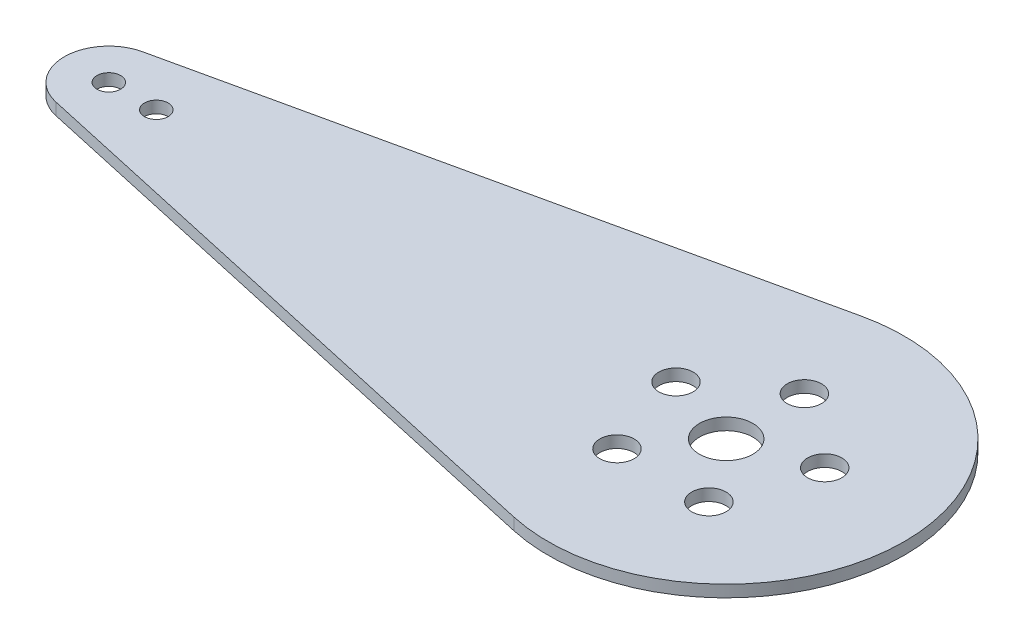
ISO-10303-21;
HEADER;
FILE_DESCRIPTION(('STEP AP214'),'2;1');
FILE_NAME('part.step','',(''),(''),'','','');
FILE_SCHEMA(('AUTOMOTIVE_DESIGN { 1 0 10303 214 1 1 1 1 }'));
ENDSEC;
DATA;
#1=APPLICATION_CONTEXT('core data for automotive mechanical design processes');
#2=APPLICATION_PROTOCOL_DEFINITION('international standard','automotive_design',2000,#1);
#3=PRODUCT_CONTEXT('',#1,'mechanical');
#4=PRODUCT('Part','Part','',(#3));
#5=PRODUCT_RELATED_PRODUCT_CATEGORY('part','',(#4));
#6=PRODUCT_DEFINITION_FORMATION('','',#4);
#7=PRODUCT_DEFINITION_CONTEXT('part definition',#1,'design');
#8=PRODUCT_DEFINITION('design','',#6,#7);
#9=PRODUCT_DEFINITION_SHAPE('','',#8);
#10=(LENGTH_UNIT() NAMED_UNIT(*) SI_UNIT(.MILLI.,.METRE.));
#11=(NAMED_UNIT(*) PLANE_ANGLE_UNIT() SI_UNIT($,.RADIAN.));
#12=(NAMED_UNIT(*) SI_UNIT($,.STERADIAN.) SOLID_ANGLE_UNIT());
#13=UNCERTAINTY_MEASURE_WITH_UNIT(LENGTH_MEASURE(1.E-05),#10,'distance_accuracy_value','');
#14=(GEOMETRIC_REPRESENTATION_CONTEXT(3) GLOBAL_UNCERTAINTY_ASSIGNED_CONTEXT((#13)) GLOBAL_UNIT_ASSIGNED_CONTEXT((#10,
#11,#12)) REPRESENTATION_CONTEXT('',''));
#15=CARTESIAN_POINT('',(0.,0.,0.));
#16=DIRECTION('',(0.,0.,1.));
#17=DIRECTION('',(1.,0.,0.));
#18=AXIS2_PLACEMENT_3D('',#15,#16,#17);
#19=CARTESIAN_POINT('',(-335.347288867355,50.8,-23.2179196647839));
#20=DIRECTION('',(0.,-1.,0.));
#21=DIRECTION('',(0.,0.,-1.));
#22=AXIS2_PLACEMENT_3D('',#19,#20,#21);
#23=PLANE('',#22);
#24=CARTESIAN_POINT('',(24.5816639876925,50.8,33.8337578877547));
#25=DIRECTION('',(0.,-1.,0.));
#26=DIRECTION('',(0.,0.,-1.));
#27=AXIS2_PLACEMENT_3D('',#24,#25,#26);
#28=CIRCLE('',#27,9.17459215458269);
#29=CARTESIAN_POINT('',(24.5816639876925,50.8,24.659165733172));
#30=VERTEX_POINT('',#29);
#31=EDGE_CURVE('E150',#30,#30,#28,.F.);
#32=ORIENTED_EDGE('',*,*,#31,.T.);
#33=EDGE_LOOP('',(#32));
#34=FACE_BOUND('',#33,.T.);
#35=CARTESIAN_POINT('',(1.69559097377339E-12,50.8,-41.8208246835345));
#36=DIRECTION('',(0.,-1.,0.));
#37=DIRECTION('',(0.,0.,-1.));
#38=AXIS2_PLACEMENT_3D('',#35,#36,#37);
#39=CIRCLE('',#38,9.17459215457969);
#40=CARTESIAN_POINT('',(1.69559097377339E-12,50.8,-50.9954168381142));
#41=VERTEX_POINT('',#40);
#42=EDGE_CURVE('E156',#41,#41,#39,.F.);
#43=ORIENTED_EDGE('',*,*,#42,.T.);
#44=EDGE_LOOP('',(#43));
#45=FACE_BOUND('',#44,.T.);
#46=CARTESIAN_POINT('',(-24.5816639876888,50.8,33.8337578877548));
#47=DIRECTION('',(0.,-1.,0.));
#48=DIRECTION('',(0.,0.,-1.));
#49=AXIS2_PLACEMENT_3D('',#46,#47,#48);
#50=CIRCLE('',#49,9.17459215458342);
#51=CARTESIAN_POINT('',(-24.5816639876888,50.8,24.6591657331714));
#52=VERTEX_POINT('',#51);
#53=EDGE_CURVE('E48',#52,#52,#50,.F.);
#54=ORIENTED_EDGE('',*,*,#53,.T.);
#55=EDGE_LOOP('',(#54));
#56=FACE_BOUND('',#55,.T.);
#57=CARTESIAN_POINT('',(-39.773967832111,50.8,-12.9233455459874));
#58=DIRECTION('',(0.,-1.,0.));
#59=DIRECTION('',(0.,0.,-1.));
#60=AXIS2_PLACEMENT_3D('',#57,#58,#59);
#61=CIRCLE('',#60,9.1745921545818);
#62=CARTESIAN_POINT('',(-39.773967832111,50.8,-22.0979377005692));
#63=VERTEX_POINT('',#62);
#64=EDGE_CURVE('E158',#63,#63,#61,.F.);
#65=ORIENTED_EDGE('',*,*,#64,.T.);
#66=EDGE_LOOP('',(#65));
#67=FACE_BOUND('',#66,.T.);
#68=CARTESIAN_POINT('',(39.7739678321145,50.8,-12.9233455459875));
#69=DIRECTION('',(0.,-1.,0.));
#70=DIRECTION('',(0.,0.,-1.));
#71=AXIS2_PLACEMENT_3D('',#68,#69,#70);
#72=CIRCLE('',#71,9.17459215458048);
#73=CARTESIAN_POINT('',(39.7739678321145,50.8,-22.097937700568));
#74=VERTEX_POINT('',#73);
#75=EDGE_CURVE('E153',#74,#74,#72,.F.);
#76=ORIENTED_EDGE('',*,*,#75,.T.);
#77=EDGE_LOOP('',(#76));
#78=FACE_BOUND('',#77,.T.);
#79=CARTESIAN_POINT('',(0.,50.8,0.));
#80=DIRECTION('',(0.,-1.,0.));
#81=DIRECTION('',(0.,0.,-1.));
#82=AXIS2_PLACEMENT_3D('',#79,#80,#81);
#83=CIRCLE('',#82,14.2875);
#84=CARTESIAN_POINT('',(0.,50.8,-14.2875));
#85=VERTEX_POINT('',#84);
#86=EDGE_CURVE('E146',#85,#85,#83,.T.);
#87=ORIENTED_EDGE('',*,*,#86,.F.);
#88=EDGE_LOOP('',(#87));
#89=FACE_BOUND('',#88,.T.);
#90=CARTESIAN_POINT('',(-304.8,50.8,0.));
#91=DIRECTION('',(0.,1.,0.));
#92=DIRECTION('',(0.,0.,1.));
#93=AXIS2_PLACEMENT_3D('',#90,#91,#92);
#94=CIRCLE('',#93,6.35);
#95=CARTESIAN_POINT('',(-304.8,50.8,6.35));
#96=VERTEX_POINT('',#95);
#97=EDGE_CURVE('E139',#96,#96,#94,.T.);
#98=ORIENTED_EDGE('',*,*,#97,.T.);
#99=EDGE_LOOP('',(#98));
#100=FACE_BOUND('',#99,.T.);
#101=CARTESIAN_POINT('',(-330.2,50.8,0.));
#102=DIRECTION('',(0.,1.,0.));
#103=DIRECTION('',(0.,0.,-1.));
#104=AXIS2_PLACEMENT_3D('',#101,#102,#103);
#105=CIRCLE('',#104,23.7816394776381);
#106=CARTESIAN_POINT('',(-335.347288867355,50.8,-23.2179196647839));
#107=VERTEX_POINT('',#106);
#108=CARTESIAN_POINT('',(-335.347288867355,50.8,23.2179196647839));
#109=VERTEX_POINT('',#108);
#110=EDGE_CURVE('E108',#107,#109,#105,.T.);
#111=ORIENTED_EDGE('',*,*,#110,.F.);
#112=DIRECTION('',(-0.976296007119933,0.,0.216439613938103));
#113=VECTOR('',#112,1.);
#114=CARTESIAN_POINT('',(-335.347288867355,50.8,-23.2179196647839));
#115=LINE('',#114,#113);
#116=CARTESIAN_POINT('',(-20.6158732276045,50.8,-92.9921946781734));
#117=VERTEX_POINT('',#116);
#118=EDGE_CURVE('E89',#117,#107,#115,.T.);
#119=ORIENTED_EDGE('',*,*,#118,.F.);
#120=CARTESIAN_POINT('',(0.,50.8,0.));
#121=DIRECTION('',(0.,1.,0.));
#122=DIRECTION('',(0.,0.,1.));
#123=AXIS2_PLACEMENT_3D('',#120,#121,#122);
#124=CIRCLE('',#123,95.2499999999998);
#125=CARTESIAN_POINT('',(-20.6158732276044,50.8,92.9921946781736));
#126=VERTEX_POINT('',#125);
#127=EDGE_CURVE('E95',#126,#117,#124,.T.);
#128=ORIENTED_EDGE('',*,*,#127,.F.);
#129=DIRECTION('',(0.976296007119933,0.,0.216439613938104));
#130=VECTOR('',#129,1.);
#131=CARTESIAN_POINT('',(-335.347288867355,50.8,23.2179196647839));
#132=LINE('',#131,#130);
#133=EDGE_CURVE('E63',#109,#126,#132,.T.);
#134=ORIENTED_EDGE('',*,*,#133,.F.);
#135=EDGE_LOOP('',(#111,#119,#128,#134));
#136=FACE_BOUND('',#135,.T.);
#137=CARTESIAN_POINT('',(-330.2,50.8,0.));
#138=DIRECTION('',(0.,1.,0.));
#139=DIRECTION('',(0.,0.,1.));
#140=AXIS2_PLACEMENT_3D('',#137,#138,#139);
#141=CIRCLE('',#140,6.35);
#142=CARTESIAN_POINT('',(-330.2,50.8,6.35000000000004));
#143=VERTEX_POINT('',#142);
#144=EDGE_CURVE('E11',#143,#143,#141,.T.);
#145=ORIENTED_EDGE('',*,*,#144,.T.);
#146=EDGE_LOOP('',(#145));
#147=FACE_BOUND('',#146,.T.);
#148=ADVANCED_FACE('F44',(#34,#45,#56,#67,#78,#89,#100,#136,#147),#23,.T.);
#149=CARTESIAN_POINT('',(-335.347288867355,57.15,23.2179196647839));
#150=DIRECTION('',(0.216439613938104,0.,-0.976296007119933));
#151=DIRECTION('',(-0.976296007119933,0.,-0.216439613938104));
#152=AXIS2_PLACEMENT_3D('',#149,#150,#151);
#153=PLANE('',#152);
#154=ORIENTED_EDGE('',*,*,#133,.T.);
#155=DIRECTION('',(0.,-1.,0.));
#156=VECTOR('',#155,1.);
#157=CARTESIAN_POINT('',(-20.6158732276044,57.15,92.9921946781736));
#158=LINE('',#157,#156);
#159=CARTESIAN_POINT('',(-20.6158732276044,57.15,92.9921946781736));
#160=VERTEX_POINT('',#159);
#161=EDGE_CURVE('E100',#160,#126,#158,.T.);
#162=ORIENTED_EDGE('',*,*,#161,.F.);
#163=DIRECTION('',(0.976296007119933,0.,0.216439613938104));
#164=VECTOR('',#163,1.);
#165=CARTESIAN_POINT('',(-335.347288867355,57.15,23.2179196647839));
#166=LINE('',#165,#164);
#167=CARTESIAN_POINT('',(-335.347288867355,57.15,23.2179196647839));
#168=VERTEX_POINT('',#167);
#169=EDGE_CURVE('E79',#168,#160,#166,.T.);
#170=ORIENTED_EDGE('',*,*,#169,.F.);
#171=DIRECTION('',(0.,-1.,0.));
#172=VECTOR('',#171,1.);
#173=CARTESIAN_POINT('',(-335.347288867355,57.15,23.2179196647839));
#174=LINE('',#173,#172);
#175=EDGE_CURVE('E149',#168,#109,#174,.T.);
#176=ORIENTED_EDGE('',*,*,#175,.T.);
#177=EDGE_LOOP('',(#154,#162,#170,#176));
#178=FACE_BOUND('',#177,.T.);
#179=ADVANCED_FACE('F179',(#178),#153,.F.);
#180=CARTESIAN_POINT('',(0.,57.15,0.));
#181=DIRECTION('',(0.,-1.,0.));
#182=DIRECTION('',(0.,0.,-1.));
#183=AXIS2_PLACEMENT_3D('',#180,#181,#182);
#184=CYLINDRICAL_SURFACE('',#183,95.2499999999998);
#185=ORIENTED_EDGE('',*,*,#127,.T.);
#186=DIRECTION('',(0.,-1.,0.));
#187=VECTOR('',#186,1.);
#188=CARTESIAN_POINT('',(-20.6158732276045,57.15,-92.9921946781734));
#189=LINE('',#188,#187);
#190=CARTESIAN_POINT('',(-20.6158732276045,57.15,-92.9921946781734));
#191=VERTEX_POINT('',#190);
#192=EDGE_CURVE('E98',#191,#117,#189,.T.);
#193=ORIENTED_EDGE('',*,*,#192,.F.);
#194=CARTESIAN_POINT('',(0.,57.15,0.));
#195=DIRECTION('',(0.,1.,0.));
#196=DIRECTION('',(0.,0.,1.));
#197=AXIS2_PLACEMENT_3D('',#194,#195,#196);
#198=CIRCLE('',#197,95.2499999999998);
#199=EDGE_CURVE('E118',#160,#191,#198,.T.);
#200=ORIENTED_EDGE('',*,*,#199,.F.);
#201=ORIENTED_EDGE('',*,*,#161,.T.);
#202=EDGE_LOOP('',(#185,#193,#200,#201));
#203=FACE_BOUND('',#202,.T.);
#204=ADVANCED_FACE('F96',(#203),#184,.T.);
#205=CARTESIAN_POINT('',(-330.2,57.15,0.));
#206=DIRECTION('',(0.,-1.,0.));
#207=DIRECTION('',(0.,0.,-1.));
#208=AXIS2_PLACEMENT_3D('',#205,#206,#207);
#209=PLANE('',#208);
#210=CARTESIAN_POINT('',(-330.2,57.15,0.));
#211=DIRECTION('',(0.,1.,0.));
#212=DIRECTION('',(0.,0.,-1.));
#213=AXIS2_PLACEMENT_3D('',#210,#211,#212);
#214=CIRCLE('',#213,23.7816394776381);
#215=CARTESIAN_POINT('',(-335.347288867355,57.15,-23.2179196647839));
#216=VERTEX_POINT('',#215);
#217=EDGE_CURVE('E109',#216,#168,#214,.T.);
#218=ORIENTED_EDGE('',*,*,#217,.T.);
#219=ORIENTED_EDGE('',*,*,#169,.T.);
#220=ORIENTED_EDGE('',*,*,#199,.T.);
#221=DIRECTION('',(-0.976296007119933,0.,0.216439613938103));
#222=VECTOR('',#221,1.);
#223=CARTESIAN_POINT('',(-335.347288867355,57.15,-23.2179196647839));
#224=LINE('',#223,#222);
#225=EDGE_CURVE('E103',#191,#216,#224,.T.);
#226=ORIENTED_EDGE('',*,*,#225,.T.);
#227=EDGE_LOOP('',(#218,#219,#220,#226));
#228=FACE_BOUND('',#227,.T.);
#229=CARTESIAN_POINT('',(24.5816639876925,57.15,33.8337578877547));
#230=DIRECTION('',(0.,1.,0.));
#231=DIRECTION('',(0.,0.,1.));
#232=AXIS2_PLACEMENT_3D('',#229,#230,#231);
#233=CIRCLE('',#232,9.17459215458269);
#234=CARTESIAN_POINT('',(24.5816639876925,57.15,43.0083500423374));
#235=VERTEX_POINT('',#234);
#236=EDGE_CURVE('E116',#235,#235,#233,.T.);
#237=ORIENTED_EDGE('',*,*,#236,.F.);
#238=EDGE_LOOP('',(#237));
#239=FACE_BOUND('',#238,.T.);
#240=CARTESIAN_POINT('',(0.,57.15,0.));
#241=DIRECTION('',(0.,1.,0.));
#242=DIRECTION('',(0.,0.,1.));
#243=AXIS2_PLACEMENT_3D('',#240,#241,#242);
#244=CIRCLE('',#243,14.2875);
#245=CARTESIAN_POINT('',(0.,57.15,14.2875));
#246=VERTEX_POINT('',#245);
#247=EDGE_CURVE('E123',#246,#246,#244,.T.);
#248=ORIENTED_EDGE('',*,*,#247,.F.);
#249=EDGE_LOOP('',(#248));
#250=FACE_BOUND('',#249,.T.);
#251=CARTESIAN_POINT('',(39.7739678321145,57.15,-12.9233455459875));
#252=DIRECTION('',(0.,1.,0.));
#253=DIRECTION('',(0.,0.,1.));
#254=AXIS2_PLACEMENT_3D('',#251,#252,#253);
#255=CIRCLE('',#254,9.17459215458048);
#256=CARTESIAN_POINT('',(39.7739678321145,57.15,-3.74875339140705));
#257=VERTEX_POINT('',#256);
#258=EDGE_CURVE('E126',#257,#257,#255,.T.);
#259=ORIENTED_EDGE('',*,*,#258,.F.);
#260=EDGE_LOOP('',(#259));
#261=FACE_BOUND('',#260,.T.);
#262=CARTESIAN_POINT('',(1.69559097377339E-12,57.15,-41.8208246835345));
#263=DIRECTION('',(0.,1.,0.));
#264=DIRECTION('',(0.,0.,1.));
#265=AXIS2_PLACEMENT_3D('',#262,#263,#264);
#266=CIRCLE('',#265,9.17459215457969);
#267=CARTESIAN_POINT('',(1.69559097377339E-12,57.15,-32.6462325289549));
#268=VERTEX_POINT('',#267);
#269=EDGE_CURVE('E129',#268,#268,#266,.T.);
#270=ORIENTED_EDGE('',*,*,#269,.F.);
#271=EDGE_LOOP('',(#270));
#272=FACE_BOUND('',#271,.T.);
#273=CARTESIAN_POINT('',(-39.773967832111,57.15,-12.9233455459874));
#274=DIRECTION('',(0.,1.,0.));
#275=DIRECTION('',(0.,0.,1.));
#276=AXIS2_PLACEMENT_3D('',#273,#274,#275);
#277=CIRCLE('',#276,9.1745921545818);
#278=CARTESIAN_POINT('',(-39.773967832111,57.15,-3.74875339140559));
#279=VERTEX_POINT('',#278);
#280=EDGE_CURVE('E132',#279,#279,#277,.T.);
#281=ORIENTED_EDGE('',*,*,#280,.F.);
#282=EDGE_LOOP('',(#281));
#283=FACE_BOUND('',#282,.T.);
#284=CARTESIAN_POINT('',(-24.5816639876888,57.15,33.8337578877548));
#285=DIRECTION('',(0.,1.,0.));
#286=DIRECTION('',(0.,0.,1.));
#287=AXIS2_PLACEMENT_3D('',#284,#285,#286);
#288=CIRCLE('',#287,9.17459215458342);
#289=CARTESIAN_POINT('',(-24.5816639876888,57.15,43.0083500423382));
#290=VERTEX_POINT('',#289);
#291=EDGE_CURVE('E135',#290,#290,#288,.T.);
#292=ORIENTED_EDGE('',*,*,#291,.F.);
#293=EDGE_LOOP('',(#292));
#294=FACE_BOUND('',#293,.T.);
#295=CARTESIAN_POINT('',(-304.8,57.15,0.));
#296=DIRECTION('',(0.,1.,0.));
#297=DIRECTION('',(0.,0.,1.));
#298=AXIS2_PLACEMENT_3D('',#295,#296,#297);
#299=CIRCLE('',#298,6.35);
#300=CARTESIAN_POINT('',(-304.8,57.15,6.35));
#301=VERTEX_POINT('',#300);
#302=EDGE_CURVE('E138',#301,#301,#299,.T.);
#303=ORIENTED_EDGE('',*,*,#302,.F.);
#304=EDGE_LOOP('',(#303));
#305=FACE_BOUND('',#304,.T.);
#306=CARTESIAN_POINT('',(-330.2,57.15,0.));
#307=DIRECTION('',(0.,1.,0.));
#308=DIRECTION('',(0.,0.,1.));
#309=AXIS2_PLACEMENT_3D('',#306,#307,#308);
#310=CIRCLE('',#309,6.35);
#311=CARTESIAN_POINT('',(-330.2,57.15,6.35000000000004));
#312=VERTEX_POINT('',#311);
#313=EDGE_CURVE('E54',#312,#312,#310,.T.);
#314=ORIENTED_EDGE('',*,*,#313,.F.);
#315=EDGE_LOOP('',(#314));
#316=FACE_BOUND('',#315,.T.);
#317=ADVANCED_FACE('F187',(#228,#239,#250,#261,#272,#283,#294,#305,#316),#209,.F.);
#318=CARTESIAN_POINT('',(-330.2,57.15,0.));
#319=DIRECTION('',(0.,-1.,0.));
#320=DIRECTION('',(0.,0.,-1.));
#321=AXIS2_PLACEMENT_3D('',#318,#319,#320);
#322=CYLINDRICAL_SURFACE('',#321,6.35);
#323=ORIENTED_EDGE('',*,*,#313,.T.);
#324=EDGE_LOOP('',(#323));
#325=FACE_BOUND('',#324,.T.);
#326=ORIENTED_EDGE('',*,*,#144,.F.);
#327=EDGE_LOOP('',(#326));
#328=FACE_BOUND('',#327,.T.);
#329=ADVANCED_FACE('F197',(#325,#328),#322,.F.);
#330=CARTESIAN_POINT('',(-304.8,57.15,0.));
#331=DIRECTION('',(0.,-1.,0.));
#332=DIRECTION('',(0.,0.,-1.));
#333=AXIS2_PLACEMENT_3D('',#330,#331,#332);
#334=CYLINDRICAL_SURFACE('',#333,6.35);
#335=ORIENTED_EDGE('',*,*,#302,.T.);
#336=EDGE_LOOP('',(#335));
#337=FACE_BOUND('',#336,.T.);
#338=ORIENTED_EDGE('',*,*,#97,.F.);
#339=EDGE_LOOP('',(#338));
#340=FACE_BOUND('',#339,.T.);
#341=ADVANCED_FACE('F198',(#337,#340),#334,.F.);
#342=CARTESIAN_POINT('',(-330.2,57.15,0.));
#343=DIRECTION('',(0.,-1.,0.));
#344=DIRECTION('',(0.,0.,-1.));
#345=AXIS2_PLACEMENT_3D('',#342,#343,#344);
#346=CYLINDRICAL_SURFACE('',#345,23.7816394776381);
#347=ORIENTED_EDGE('',*,*,#110,.T.);
#348=ORIENTED_EDGE('',*,*,#175,.F.);
#349=ORIENTED_EDGE('',*,*,#217,.F.);
#350=DIRECTION('',(0.,-1.,0.));
#351=VECTOR('',#350,1.);
#352=CARTESIAN_POINT('',(-335.347288867355,57.15,-23.2179196647839));
#353=LINE('',#352,#351);
#354=EDGE_CURVE('E104',#216,#107,#353,.T.);
#355=ORIENTED_EDGE('',*,*,#354,.T.);
#356=EDGE_LOOP('',(#347,#348,#349,#355));
#357=FACE_BOUND('',#356,.T.);
#358=ADVANCED_FACE('F177',(#357),#346,.T.);
#359=CARTESIAN_POINT('',(-335.347288867355,57.15,-23.2179196647839));
#360=DIRECTION('',(0.216439613938103,0.,0.976296007119933));
#361=DIRECTION('',(0.976296007119933,0.,-0.216439613938103));
#362=AXIS2_PLACEMENT_3D('',#359,#360,#361);
#363=PLANE('',#362);
#364=ORIENTED_EDGE('',*,*,#118,.T.);
#365=ORIENTED_EDGE('',*,*,#354,.F.);
#366=ORIENTED_EDGE('',*,*,#225,.F.);
#367=ORIENTED_EDGE('',*,*,#192,.T.);
#368=EDGE_LOOP('',(#364,#365,#366,#367));
#369=FACE_BOUND('',#368,.T.);
#370=ADVANCED_FACE('F102',(#369),#363,.F.);
#371=CARTESIAN_POINT('',(-24.5816639876888,44.45,33.8337578877548));
#372=DIRECTION('',(0.,1.,0.));
#373=DIRECTION('',(0.,0.,1.));
#374=AXIS2_PLACEMENT_3D('',#371,#372,#373);
#375=CYLINDRICAL_SURFACE('',#374,9.17459215458342);
#376=ORIENTED_EDGE('',*,*,#291,.T.);
#377=EDGE_LOOP('',(#376));
#378=FACE_BOUND('',#377,.T.);
#379=ORIENTED_EDGE('',*,*,#53,.F.);
#380=EDGE_LOOP('',(#379));
#381=FACE_BOUND('',#380,.T.);
#382=ADVANCED_FACE('F46',(#378,#381),#375,.F.);
#383=CARTESIAN_POINT('',(-39.773967832111,44.45,-12.9233455459874));
#384=DIRECTION('',(0.,1.,0.));
#385=DIRECTION('',(0.,0.,1.));
#386=AXIS2_PLACEMENT_3D('',#383,#384,#385);
#387=CYLINDRICAL_SURFACE('',#386,9.1745921545818);
#388=ORIENTED_EDGE('',*,*,#280,.T.);
#389=EDGE_LOOP('',(#388));
#390=FACE_BOUND('',#389,.T.);
#391=ORIENTED_EDGE('',*,*,#64,.F.);
#392=EDGE_LOOP('',(#391));
#393=FACE_BOUND('',#392,.T.);
#394=ADVANCED_FACE('F167',(#390,#393),#387,.F.);
#395=CARTESIAN_POINT('',(1.69559097377339E-12,44.45,-41.8208246835345));
#396=DIRECTION('',(0.,1.,0.));
#397=DIRECTION('',(0.,0.,1.));
#398=AXIS2_PLACEMENT_3D('',#395,#396,#397);
#399=CYLINDRICAL_SURFACE('',#398,9.17459215457969);
#400=ORIENTED_EDGE('',*,*,#269,.T.);
#401=EDGE_LOOP('',(#400));
#402=FACE_BOUND('',#401,.T.);
#403=ORIENTED_EDGE('',*,*,#42,.F.);
#404=EDGE_LOOP('',(#403));
#405=FACE_BOUND('',#404,.T.);
#406=ADVANCED_FACE('F174',(#402,#405),#399,.F.);
#407=CARTESIAN_POINT('',(39.7739678321145,44.45,-12.9233455459875));
#408=DIRECTION('',(0.,1.,0.));
#409=DIRECTION('',(0.,0.,1.));
#410=AXIS2_PLACEMENT_3D('',#407,#408,#409);
#411=CYLINDRICAL_SURFACE('',#410,9.17459215458048);
#412=ORIENTED_EDGE('',*,*,#258,.T.);
#413=EDGE_LOOP('',(#412));
#414=FACE_BOUND('',#413,.T.);
#415=ORIENTED_EDGE('',*,*,#75,.F.);
#416=EDGE_LOOP('',(#415));
#417=FACE_BOUND('',#416,.T.);
#418=ADVANCED_FACE('F211',(#414,#417),#411,.F.);
#419=CARTESIAN_POINT('',(24.5816639876925,44.45,33.8337578877547));
#420=DIRECTION('',(0.,1.,0.));
#421=DIRECTION('',(0.,0.,1.));
#422=AXIS2_PLACEMENT_3D('',#419,#420,#421);
#423=CYLINDRICAL_SURFACE('',#422,9.17459215458269);
#424=ORIENTED_EDGE('',*,*,#236,.T.);
#425=EDGE_LOOP('',(#424));
#426=FACE_BOUND('',#425,.T.);
#427=ORIENTED_EDGE('',*,*,#31,.F.);
#428=EDGE_LOOP('',(#427));
#429=FACE_BOUND('',#428,.T.);
#430=ADVANCED_FACE('F207',(#426,#429),#423,.F.);
#431=CARTESIAN_POINT('',(0.,6.35,0.));
#432=DIRECTION('',(0.,-1.,0.));
#433=DIRECTION('',(0.,0.,-1.));
#434=AXIS2_PLACEMENT_3D('',#431,#432,#433);
#435=CYLINDRICAL_SURFACE('',#434,14.2875);
#436=ORIENTED_EDGE('',*,*,#247,.T.);
#437=EDGE_LOOP('',(#436));
#438=FACE_BOUND('',#437,.T.);
#439=ORIENTED_EDGE('',*,*,#86,.T.);
#440=EDGE_LOOP('',(#439));
#441=FACE_BOUND('',#440,.T.);
#442=ADVANCED_FACE('F192',(#438,#441),#435,.F.);
#443=CLOSED_SHELL('',(#148,#179,#204,#317,#329,#341,#358,#370,#382,#394,#406,#418,#430,#442));
#444=MANIFOLD_SOLID_BREP('B2',#443);
#445=ADVANCED_BREP_SHAPE_REPRESENTATION('',(#18,#444),#14);
#446=SHAPE_DEFINITION_REPRESENTATION(#9,#445);
ENDSEC;
END-ISO-10303-21;
